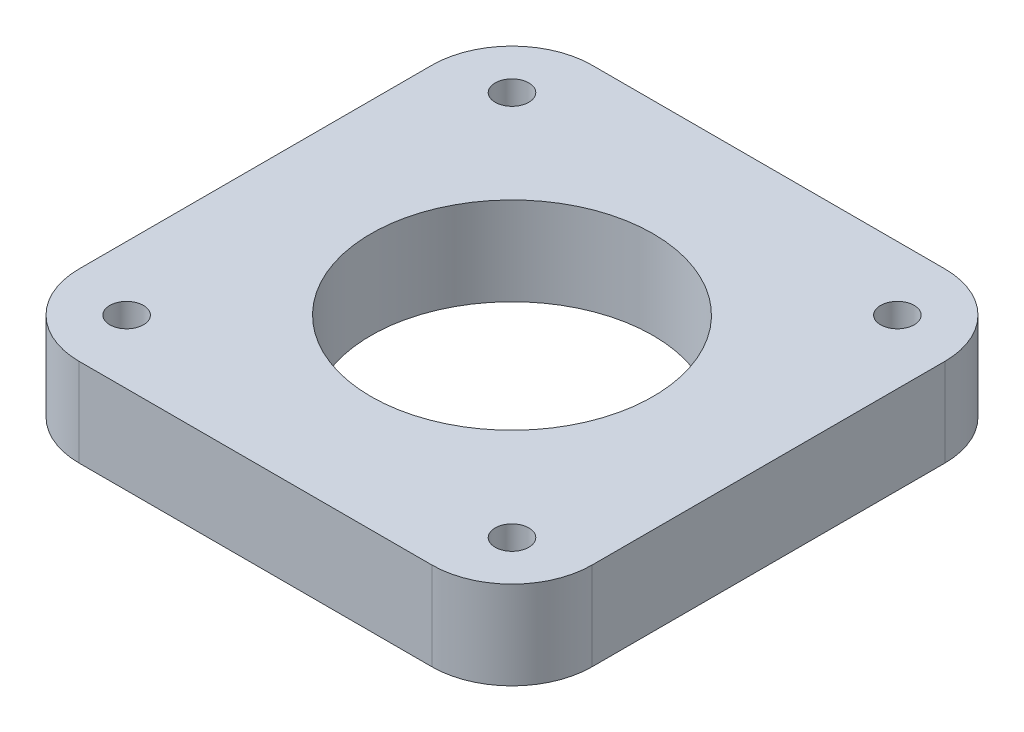
ISO-10303-21;
HEADER;
FILE_DESCRIPTION(('STEP AP214'),'2;1');
FILE_NAME('part.step','',(''),(''),'','','');
FILE_SCHEMA(('AUTOMOTIVE_DESIGN { 1 0 10303 214 1 1 1 1 }'));
ENDSEC;
DATA;
#1=APPLICATION_CONTEXT('core data for automotive mechanical design processes');
#2=APPLICATION_PROTOCOL_DEFINITION('international standard','automotive_design',2000,#1);
#3=PRODUCT_CONTEXT('',#1,'mechanical');
#4=PRODUCT('Part','Part','',(#3));
#5=PRODUCT_RELATED_PRODUCT_CATEGORY('part','',(#4));
#6=PRODUCT_DEFINITION_FORMATION('','',#4);
#7=PRODUCT_DEFINITION_CONTEXT('part definition',#1,'design');
#8=PRODUCT_DEFINITION('design','',#6,#7);
#9=PRODUCT_DEFINITION_SHAPE('','',#8);
#10=(LENGTH_UNIT() NAMED_UNIT(*) SI_UNIT(.MILLI.,.METRE.));
#11=(NAMED_UNIT(*) PLANE_ANGLE_UNIT() SI_UNIT($,.RADIAN.));
#12=(NAMED_UNIT(*) SI_UNIT($,.STERADIAN.) SOLID_ANGLE_UNIT());
#13=UNCERTAINTY_MEASURE_WITH_UNIT(LENGTH_MEASURE(1.E-05),#10,'distance_accuracy_value','');
#14=(GEOMETRIC_REPRESENTATION_CONTEXT(3) GLOBAL_UNCERTAINTY_ASSIGNED_CONTEXT((#13)) GLOBAL_UNIT_ASSIGNED_CONTEXT((#10,
#11,#12)) REPRESENTATION_CONTEXT('',''));
#15=CARTESIAN_POINT('',(0.,0.,0.));
#16=DIRECTION('',(0.,0.,1.));
#17=DIRECTION('',(1.,0.,0.));
#18=AXIS2_PLACEMENT_3D('',#15,#16,#17);
#19=CARTESIAN_POINT('',(32.,11.,32.));
#20=DIRECTION('',(-1.,0.,0.));
#21=DIRECTION('',(0.,0.,1.));
#22=AXIS2_PLACEMENT_3D('',#19,#20,#21);
#23=PLANE('',#22);
#24=DIRECTION('',(0.,0.,-1.));
#25=VECTOR('',#24,1.);
#26=CARTESIAN_POINT('',(32.,11.,32.));
#27=LINE('',#26,#25);
#28=CARTESIAN_POINT('',(32.,11.,22.));
#29=VERTEX_POINT('',#28);
#30=CARTESIAN_POINT('',(32.,11.,-22.));
#31=VERTEX_POINT('',#30);
#32=EDGE_CURVE('E129',#29,#31,#27,.T.);
#33=ORIENTED_EDGE('',*,*,#32,.F.);
#34=DIRECTION('',(0.,-1.,0.));
#35=VECTOR('',#34,1.);
#36=CARTESIAN_POINT('',(32.,11.,22.));
#37=LINE('',#36,#35);
#38=CARTESIAN_POINT('',(32.,0.,22.));
#39=VERTEX_POINT('',#38);
#40=EDGE_CURVE('E114',#29,#39,#37,.T.);
#41=ORIENTED_EDGE('',*,*,#40,.T.);
#42=DIRECTION('',(0.,0.,-1.));
#43=VECTOR('',#42,1.);
#44=CARTESIAN_POINT('',(32.,0.,32.));
#45=LINE('',#44,#43);
#46=CARTESIAN_POINT('',(32.,0.,-22.));
#47=VERTEX_POINT('',#46);
#48=EDGE_CURVE('E126',#39,#47,#45,.T.);
#49=ORIENTED_EDGE('',*,*,#48,.T.);
#50=DIRECTION('',(0.,-1.,0.));
#51=VECTOR('',#50,1.);
#52=CARTESIAN_POINT('',(32.,11.,-22.));
#53=LINE('',#52,#51);
#54=EDGE_CURVE('E131',#47,#31,#53,.F.);
#55=ORIENTED_EDGE('',*,*,#54,.T.);
#56=EDGE_LOOP('',(#33,#41,#49,#55));
#57=FACE_BOUND('',#56,.T.);
#58=ADVANCED_FACE('F43',(#57),#23,.F.);
#59=CARTESIAN_POINT('',(-32.,11.,-32.));
#60=DIRECTION('',(0.,0.,1.));
#61=DIRECTION('',(1.,0.,0.));
#62=AXIS2_PLACEMENT_3D('',#59,#60,#61);
#63=PLANE('',#62);
#64=DIRECTION('',(-1.,0.,0.));
#65=VECTOR('',#64,1.);
#66=CARTESIAN_POINT('',(-32.,11.,-32.));
#67=LINE('',#66,#65);
#68=CARTESIAN_POINT('',(22.,11.,-32.));
#69=VERTEX_POINT('',#68);
#70=CARTESIAN_POINT('',(-22.,11.,-32.));
#71=VERTEX_POINT('',#70);
#72=EDGE_CURVE('E173',#69,#71,#67,.T.);
#73=ORIENTED_EDGE('',*,*,#72,.F.);
#74=DIRECTION('',(0.,-1.,0.));
#75=VECTOR('',#74,1.);
#76=CARTESIAN_POINT('',(22.,11.,-32.));
#77=LINE('',#76,#75);
#78=CARTESIAN_POINT('',(22.,0.,-32.));
#79=VERTEX_POINT('',#78);
#80=EDGE_CURVE('E11',#69,#79,#77,.T.);
#81=ORIENTED_EDGE('',*,*,#80,.T.);
#82=DIRECTION('',(-1.,0.,0.));
#83=VECTOR('',#82,1.);
#84=CARTESIAN_POINT('',(-32.,0.,-32.));
#85=LINE('',#84,#83);
#86=CARTESIAN_POINT('',(-22.,0.,-32.));
#87=VERTEX_POINT('',#86);
#88=EDGE_CURVE('E136',#79,#87,#85,.T.);
#89=ORIENTED_EDGE('',*,*,#88,.T.);
#90=DIRECTION('',(0.,-1.,0.));
#91=VECTOR('',#90,1.);
#92=CARTESIAN_POINT('',(-22.,11.,-32.));
#93=LINE('',#92,#91);
#94=EDGE_CURVE('E51',#87,#71,#93,.F.);
#95=ORIENTED_EDGE('',*,*,#94,.T.);
#96=EDGE_LOOP('',(#73,#81,#89,#95));
#97=FACE_BOUND('',#96,.T.);
#98=ADVANCED_FACE('F172',(#97),#63,.F.);
#99=CARTESIAN_POINT('',(-32.,11.,32.));
#100=DIRECTION('',(1.,0.,0.));
#101=DIRECTION('',(0.,0.,-1.));
#102=AXIS2_PLACEMENT_3D('',#99,#100,#101);
#103=PLANE('',#102);
#104=DIRECTION('',(0.,0.,1.));
#105=VECTOR('',#104,1.);
#106=CARTESIAN_POINT('',(-32.,0.,32.));
#107=LINE('',#106,#105);
#108=CARTESIAN_POINT('',(-32.,0.,-22.));
#109=VERTEX_POINT('',#108);
#110=CARTESIAN_POINT('',(-32.,0.,22.));
#111=VERTEX_POINT('',#110);
#112=EDGE_CURVE('E140',#109,#111,#107,.T.);
#113=ORIENTED_EDGE('',*,*,#112,.T.);
#114=DIRECTION('',(0.,-1.,0.));
#115=VECTOR('',#114,1.);
#116=CARTESIAN_POINT('',(-32.,11.,22.));
#117=LINE('',#116,#115);
#118=CARTESIAN_POINT('',(-32.,11.,22.));
#119=VERTEX_POINT('',#118);
#120=EDGE_CURVE('E58',#111,#119,#117,.F.);
#121=ORIENTED_EDGE('',*,*,#120,.T.);
#122=DIRECTION('',(0.,0.,1.));
#123=VECTOR('',#122,1.);
#124=CARTESIAN_POINT('',(-32.,11.,32.));
#125=LINE('',#124,#123);
#126=CARTESIAN_POINT('',(-32.,11.,-22.));
#127=VERTEX_POINT('',#126);
#128=EDGE_CURVE('E179',#127,#119,#125,.T.);
#129=ORIENTED_EDGE('',*,*,#128,.F.);
#130=DIRECTION('',(0.,-1.,0.));
#131=VECTOR('',#130,1.);
#132=CARTESIAN_POINT('',(-32.,11.,-22.));
#133=LINE('',#132,#131);
#134=EDGE_CURVE('E166',#127,#109,#133,.T.);
#135=ORIENTED_EDGE('',*,*,#134,.T.);
#136=EDGE_LOOP('',(#113,#121,#129,#135));
#137=FACE_BOUND('',#136,.T.);
#138=ADVANCED_FACE('F183',(#137),#103,.F.);
#139=CARTESIAN_POINT('',(-32.,11.,32.));
#140=DIRECTION('',(0.,0.,-1.));
#141=DIRECTION('',(-1.,0.,0.));
#142=AXIS2_PLACEMENT_3D('',#139,#140,#141);
#143=PLANE('',#142);
#144=DIRECTION('',(1.,0.,0.));
#145=VECTOR('',#144,1.);
#146=CARTESIAN_POINT('',(-32.,0.,32.));
#147=LINE('',#146,#145);
#148=CARTESIAN_POINT('',(-22.,0.,32.));
#149=VERTEX_POINT('',#148);
#150=CARTESIAN_POINT('',(22.,0.,32.));
#151=VERTEX_POINT('',#150);
#152=EDGE_CURVE('E150',#149,#151,#147,.T.);
#153=ORIENTED_EDGE('',*,*,#152,.T.);
#154=DIRECTION('',(0.,-1.,0.));
#155=VECTOR('',#154,1.);
#156=CARTESIAN_POINT('',(22.,11.,32.));
#157=LINE('',#156,#155);
#158=CARTESIAN_POINT('',(22.,11.,32.));
#159=VERTEX_POINT('',#158);
#160=EDGE_CURVE('E115',#151,#159,#157,.F.);
#161=ORIENTED_EDGE('',*,*,#160,.T.);
#162=DIRECTION('',(1.,0.,0.));
#163=VECTOR('',#162,1.);
#164=CARTESIAN_POINT('',(-32.,11.,32.));
#165=LINE('',#164,#163);
#166=CARTESIAN_POINT('',(-22.,11.,32.));
#167=VERTEX_POINT('',#166);
#168=EDGE_CURVE('E146',#167,#159,#165,.T.);
#169=ORIENTED_EDGE('',*,*,#168,.F.);
#170=DIRECTION('',(0.,-1.,0.));
#171=VECTOR('',#170,1.);
#172=CARTESIAN_POINT('',(-22.,11.,32.));
#173=LINE('',#172,#171);
#174=EDGE_CURVE('E120',#167,#149,#173,.T.);
#175=ORIENTED_EDGE('',*,*,#174,.T.);
#176=EDGE_LOOP('',(#153,#161,#169,#175));
#177=FACE_BOUND('',#176,.T.);
#178=ADVANCED_FACE('F190',(#177),#143,.F.);
#179=CARTESIAN_POINT('',(0.,11.,0.));
#180=DIRECTION('',(0.,-1.,0.));
#181=DIRECTION('',(0.,0.,-1.));
#182=AXIS2_PLACEMENT_3D('',#179,#180,#181);
#183=PLANE('',#182);
#184=CARTESIAN_POINT('',(-24.0416305603426,11.,-24.0416305603426));
#185=DIRECTION('',(0.,1.,0.));
#186=DIRECTION('',(0.,0.,1.));
#187=AXIS2_PLACEMENT_3D('',#184,#185,#186);
#188=CIRCLE('',#187,2.1);
#189=CARTESIAN_POINT('',(-24.0416305603426,11.,-21.9416305603426));
#190=VERTEX_POINT('',#189);
#191=EDGE_CURVE('E199',#190,#190,#188,.T.);
#192=ORIENTED_EDGE('',*,*,#191,.F.);
#193=EDGE_LOOP('',(#192));
#194=FACE_BOUND('',#193,.T.);
#195=CARTESIAN_POINT('',(-24.0416305603426,11.,24.0416305603426));
#196=DIRECTION('',(0.,1.,0.));
#197=DIRECTION('',(0.,0.,1.));
#198=AXIS2_PLACEMENT_3D('',#195,#196,#197);
#199=CIRCLE('',#198,2.1);
#200=CARTESIAN_POINT('',(-24.0416305603426,11.,26.1416305603426));
#201=VERTEX_POINT('',#200);
#202=EDGE_CURVE('E205',#201,#201,#199,.T.);
#203=ORIENTED_EDGE('',*,*,#202,.F.);
#204=EDGE_LOOP('',(#203));
#205=FACE_BOUND('',#204,.T.);
#206=CARTESIAN_POINT('',(24.0416305603426,11.,24.0416305603426));
#207=DIRECTION('',(0.,1.,0.));
#208=DIRECTION('',(0.,0.,1.));
#209=AXIS2_PLACEMENT_3D('',#206,#207,#208);
#210=CIRCLE('',#209,2.1);
#211=CARTESIAN_POINT('',(24.0416305603426,11.,26.1416305603426));
#212=VERTEX_POINT('',#211);
#213=EDGE_CURVE('E211',#212,#212,#210,.T.);
#214=ORIENTED_EDGE('',*,*,#213,.F.);
#215=EDGE_LOOP('',(#214));
#216=FACE_BOUND('',#215,.T.);
#217=CARTESIAN_POINT('',(24.0416305603426,11.,-24.0416305603426));
#218=DIRECTION('',(0.,1.,0.));
#219=DIRECTION('',(0.,0.,1.));
#220=AXIS2_PLACEMENT_3D('',#217,#218,#219);
#221=CIRCLE('',#220,2.1);
#222=CARTESIAN_POINT('',(24.0416305603426,11.,-21.9416305603426));
#223=VERTEX_POINT('',#222);
#224=EDGE_CURVE('E194',#223,#223,#221,.T.);
#225=ORIENTED_EDGE('',*,*,#224,.F.);
#226=EDGE_LOOP('',(#225));
#227=FACE_BOUND('',#226,.T.);
#228=CARTESIAN_POINT('',(0.,11.,0.));
#229=DIRECTION('',(0.,1.,0.));
#230=DIRECTION('',(0.,0.,1.));
#231=AXIS2_PLACEMENT_3D('',#228,#229,#230);
#232=CIRCLE('',#231,17.6);
#233=CARTESIAN_POINT('',(0.,11.,17.6));
#234=VERTEX_POINT('',#233);
#235=EDGE_CURVE('E143',#234,#234,#232,.T.);
#236=ORIENTED_EDGE('',*,*,#235,.F.);
#237=EDGE_LOOP('',(#236));
#238=FACE_BOUND('',#237,.T.);
#239=ORIENTED_EDGE('',*,*,#168,.T.);
#240=CARTESIAN_POINT('',(22.,11.,22.));
#241=DIRECTION('',(0.,-1.,0.));
#242=DIRECTION('',(0.,0.,-1.));
#243=AXIS2_PLACEMENT_3D('',#240,#241,#242);
#244=CIRCLE('',#243,10.);
#245=EDGE_CURVE('E164',#159,#29,#244,.F.);
#246=ORIENTED_EDGE('',*,*,#245,.T.);
#247=ORIENTED_EDGE('',*,*,#32,.T.);
#248=CARTESIAN_POINT('',(22.,11.,-22.));
#249=DIRECTION('',(0.,-1.,0.));
#250=DIRECTION('',(0.,0.,-1.));
#251=AXIS2_PLACEMENT_3D('',#248,#249,#250);
#252=CIRCLE('',#251,10.);
#253=EDGE_CURVE('E160',#31,#69,#252,.F.);
#254=ORIENTED_EDGE('',*,*,#253,.T.);
#255=ORIENTED_EDGE('',*,*,#72,.T.);
#256=CARTESIAN_POINT('',(-22.,11.,-22.));
#257=DIRECTION('',(0.,-1.,0.));
#258=DIRECTION('',(0.,0.,-1.));
#259=AXIS2_PLACEMENT_3D('',#256,#257,#258);
#260=CIRCLE('',#259,10.);
#261=EDGE_CURVE('E65',#71,#127,#260,.F.);
#262=ORIENTED_EDGE('',*,*,#261,.T.);
#263=ORIENTED_EDGE('',*,*,#128,.T.);
#264=CARTESIAN_POINT('',(-22.,11.,22.));
#265=DIRECTION('',(0.,-1.,0.));
#266=DIRECTION('',(0.,0.,-1.));
#267=AXIS2_PLACEMENT_3D('',#264,#265,#266);
#268=CIRCLE('',#267,10.);
#269=EDGE_CURVE('E162',#119,#167,#268,.F.);
#270=ORIENTED_EDGE('',*,*,#269,.T.);
#271=EDGE_LOOP('',(#239,#246,#247,#254,#255,#262,#263,#270));
#272=FACE_BOUND('',#271,.T.);
#273=ADVANCED_FACE('F177',(#194,#205,#216,#227,#238,#272),#183,.F.);
#274=CARTESIAN_POINT('',(0.,0.,0.));
#275=DIRECTION('',(0.,-1.,0.));
#276=DIRECTION('',(0.,0.,-1.));
#277=AXIS2_PLACEMENT_3D('',#274,#275,#276);
#278=PLANE('',#277);
#279=CARTESIAN_POINT('',(-24.0416305603426,0.,-24.0416305603426));
#280=DIRECTION('',(0.,1.,0.));
#281=DIRECTION('',(0.,0.,1.));
#282=AXIS2_PLACEMENT_3D('',#279,#280,#281);
#283=CIRCLE('',#282,2.1);
#284=CARTESIAN_POINT('',(-24.0416305603426,0.,-21.9416305603426));
#285=VERTEX_POINT('',#284);
#286=EDGE_CURVE('E196',#285,#285,#283,.T.);
#287=ORIENTED_EDGE('',*,*,#286,.T.);
#288=EDGE_LOOP('',(#287));
#289=FACE_BOUND('',#288,.T.);
#290=CARTESIAN_POINT('',(-24.0416305603426,0.,24.0416305603426));
#291=DIRECTION('',(0.,1.,0.));
#292=DIRECTION('',(0.,0.,1.));
#293=AXIS2_PLACEMENT_3D('',#290,#291,#292);
#294=CIRCLE('',#293,2.1);
#295=CARTESIAN_POINT('',(-24.0416305603426,0.,26.1416305603426));
#296=VERTEX_POINT('',#295);
#297=EDGE_CURVE('E202',#296,#296,#294,.T.);
#298=ORIENTED_EDGE('',*,*,#297,.T.);
#299=EDGE_LOOP('',(#298));
#300=FACE_BOUND('',#299,.T.);
#301=CARTESIAN_POINT('',(24.0416305603426,0.,24.0416305603426));
#302=DIRECTION('',(0.,1.,0.));
#303=DIRECTION('',(0.,0.,1.));
#304=AXIS2_PLACEMENT_3D('',#301,#302,#303);
#305=CIRCLE('',#304,2.1);
#306=CARTESIAN_POINT('',(24.0416305603426,0.,26.1416305603426));
#307=VERTEX_POINT('',#306);
#308=EDGE_CURVE('E208',#307,#307,#305,.T.);
#309=ORIENTED_EDGE('',*,*,#308,.T.);
#310=EDGE_LOOP('',(#309));
#311=FACE_BOUND('',#310,.T.);
#312=CARTESIAN_POINT('',(24.0416305603426,0.,-24.0416305603426));
#313=DIRECTION('',(0.,1.,0.));
#314=DIRECTION('',(0.,0.,1.));
#315=AXIS2_PLACEMENT_3D('',#312,#313,#314);
#316=CIRCLE('',#315,2.1);
#317=CARTESIAN_POINT('',(24.0416305603426,0.,-21.9416305603426));
#318=VERTEX_POINT('',#317);
#319=EDGE_CURVE('E214',#318,#318,#316,.T.);
#320=ORIENTED_EDGE('',*,*,#319,.T.);
#321=EDGE_LOOP('',(#320));
#322=FACE_BOUND('',#321,.T.);
#323=CARTESIAN_POINT('',(0.,0.,0.));
#324=DIRECTION('',(0.,1.,0.));
#325=DIRECTION('',(0.,0.,1.));
#326=AXIS2_PLACEMENT_3D('',#323,#324,#325);
#327=CIRCLE('',#326,17.6);
#328=CARTESIAN_POINT('',(0.,0.,17.6));
#329=VERTEX_POINT('',#328);
#330=EDGE_CURVE('E137',#329,#329,#327,.T.);
#331=ORIENTED_EDGE('',*,*,#330,.T.);
#332=EDGE_LOOP('',(#331));
#333=FACE_BOUND('',#332,.T.);
#334=ORIENTED_EDGE('',*,*,#48,.F.);
#335=CARTESIAN_POINT('',(22.,0.,22.));
#336=DIRECTION('',(0.,-1.,0.));
#337=DIRECTION('',(0.,0.,-1.));
#338=AXIS2_PLACEMENT_3D('',#335,#336,#337);
#339=CIRCLE('',#338,10.);
#340=EDGE_CURVE('E110',#39,#151,#339,.T.);
#341=ORIENTED_EDGE('',*,*,#340,.T.);
#342=ORIENTED_EDGE('',*,*,#152,.F.);
#343=CARTESIAN_POINT('',(-22.,0.,22.));
#344=DIRECTION('',(0.,-1.,0.));
#345=DIRECTION('',(0.,0.,-1.));
#346=AXIS2_PLACEMENT_3D('',#343,#344,#345);
#347=CIRCLE('',#346,10.);
#348=EDGE_CURVE('E121',#149,#111,#347,.T.);
#349=ORIENTED_EDGE('',*,*,#348,.T.);
#350=ORIENTED_EDGE('',*,*,#112,.F.);
#351=CARTESIAN_POINT('',(-22.,0.,-22.));
#352=DIRECTION('',(0.,-1.,0.));
#353=DIRECTION('',(0.,0.,-1.));
#354=AXIS2_PLACEMENT_3D('',#351,#352,#353);
#355=CIRCLE('',#354,10.);
#356=EDGE_CURVE('E130',#109,#87,#355,.T.);
#357=ORIENTED_EDGE('',*,*,#356,.T.);
#358=ORIENTED_EDGE('',*,*,#88,.F.);
#359=CARTESIAN_POINT('',(22.,0.,-22.));
#360=DIRECTION('',(0.,-1.,0.));
#361=DIRECTION('',(0.,0.,-1.));
#362=AXIS2_PLACEMENT_3D('',#359,#360,#361);
#363=CIRCLE('',#362,10.);
#364=EDGE_CURVE('E135',#79,#47,#363,.T.);
#365=ORIENTED_EDGE('',*,*,#364,.T.);
#366=EDGE_LOOP('',(#334,#341,#342,#349,#350,#357,#358,#365));
#367=FACE_BOUND('',#366,.T.);
#368=ADVANCED_FACE('F133',(#289,#300,#311,#322,#333,#367),#278,.T.);
#369=CARTESIAN_POINT('',(0.,0.,0.));
#370=DIRECTION('',(0.,1.,0.));
#371=DIRECTION('',(0.,0.,1.));
#372=AXIS2_PLACEMENT_3D('',#369,#370,#371);
#373=CYLINDRICAL_SURFACE('',#372,17.6);
#374=ORIENTED_EDGE('',*,*,#330,.F.);
#375=EDGE_LOOP('',(#374));
#376=FACE_BOUND('',#375,.T.);
#377=ORIENTED_EDGE('',*,*,#235,.T.);
#378=EDGE_LOOP('',(#377));
#379=FACE_BOUND('',#378,.T.);
#380=ADVANCED_FACE('F228',(#376,#379),#373,.F.);
#381=CARTESIAN_POINT('',(24.0416305603426,0.,-24.0416305603426));
#382=DIRECTION('',(0.,1.,0.));
#383=DIRECTION('',(0.,0.,1.));
#384=AXIS2_PLACEMENT_3D('',#381,#382,#383);
#385=CYLINDRICAL_SURFACE('',#384,2.1);
#386=ORIENTED_EDGE('',*,*,#319,.F.);
#387=EDGE_LOOP('',(#386));
#388=FACE_BOUND('',#387,.T.);
#389=ORIENTED_EDGE('',*,*,#224,.T.);
#390=EDGE_LOOP('',(#389));
#391=FACE_BOUND('',#390,.T.);
#392=ADVANCED_FACE('F220',(#388,#391),#385,.F.);
#393=CARTESIAN_POINT('',(24.0416305603426,0.,24.0416305603426));
#394=DIRECTION('',(0.,1.,0.));
#395=DIRECTION('',(0.,0.,1.));
#396=AXIS2_PLACEMENT_3D('',#393,#394,#395);
#397=CYLINDRICAL_SURFACE('',#396,2.1);
#398=ORIENTED_EDGE('',*,*,#308,.F.);
#399=EDGE_LOOP('',(#398));
#400=FACE_BOUND('',#399,.T.);
#401=ORIENTED_EDGE('',*,*,#213,.T.);
#402=EDGE_LOOP('',(#401));
#403=FACE_BOUND('',#402,.T.);
#404=ADVANCED_FACE('F235',(#400,#403),#397,.F.);
#405=CARTESIAN_POINT('',(-24.0416305603426,0.,24.0416305603426));
#406=DIRECTION('',(0.,1.,0.));
#407=DIRECTION('',(0.,0.,1.));
#408=AXIS2_PLACEMENT_3D('',#405,#406,#407);
#409=CYLINDRICAL_SURFACE('',#408,2.1);
#410=ORIENTED_EDGE('',*,*,#297,.F.);
#411=EDGE_LOOP('',(#410));
#412=FACE_BOUND('',#411,.T.);
#413=ORIENTED_EDGE('',*,*,#202,.T.);
#414=EDGE_LOOP('',(#413));
#415=FACE_BOUND('',#414,.T.);
#416=ADVANCED_FACE('F289',(#412,#415),#409,.F.);
#417=CARTESIAN_POINT('',(-24.0416305603426,0.,-24.0416305603426));
#418=DIRECTION('',(0.,1.,0.));
#419=DIRECTION('',(0.,0.,1.));
#420=AXIS2_PLACEMENT_3D('',#417,#418,#419);
#421=CYLINDRICAL_SURFACE('',#420,2.1);
#422=ORIENTED_EDGE('',*,*,#286,.F.);
#423=EDGE_LOOP('',(#422));
#424=FACE_BOUND('',#423,.T.);
#425=ORIENTED_EDGE('',*,*,#191,.T.);
#426=EDGE_LOOP('',(#425));
#427=FACE_BOUND('',#426,.T.);
#428=ADVANCED_FACE('F252',(#424,#427),#421,.F.);
#429=CARTESIAN_POINT('',(22.,11.,22.));
#430=DIRECTION('',(0.,-1.,0.));
#431=DIRECTION('',(0.,0.,-1.));
#432=AXIS2_PLACEMENT_3D('',#429,#430,#431);
#433=CYLINDRICAL_SURFACE('',#432,10.);
#434=ORIENTED_EDGE('',*,*,#245,.F.);
#435=ORIENTED_EDGE('',*,*,#160,.F.);
#436=ORIENTED_EDGE('',*,*,#340,.F.);
#437=ORIENTED_EDGE('',*,*,#40,.F.);
#438=EDGE_LOOP('',(#434,#435,#436,#437));
#439=FACE_BOUND('',#438,.T.);
#440=ADVANCED_FACE('F113',(#439),#433,.T.);
#441=CARTESIAN_POINT('',(-22.,11.,22.));
#442=DIRECTION('',(0.,-1.,0.));
#443=DIRECTION('',(0.,0.,-1.));
#444=AXIS2_PLACEMENT_3D('',#441,#442,#443);
#445=CYLINDRICAL_SURFACE('',#444,10.);
#446=ORIENTED_EDGE('',*,*,#269,.F.);
#447=ORIENTED_EDGE('',*,*,#120,.F.);
#448=ORIENTED_EDGE('',*,*,#348,.F.);
#449=ORIENTED_EDGE('',*,*,#174,.F.);
#450=EDGE_LOOP('',(#446,#447,#448,#449));
#451=FACE_BOUND('',#450,.T.);
#452=ADVANCED_FACE('F187',(#451),#445,.T.);
#453=CARTESIAN_POINT('',(22.,11.,-22.));
#454=DIRECTION('',(0.,-1.,0.));
#455=DIRECTION('',(0.,0.,-1.));
#456=AXIS2_PLACEMENT_3D('',#453,#454,#455);
#457=CYLINDRICAL_SURFACE('',#456,10.);
#458=ORIENTED_EDGE('',*,*,#253,.F.);
#459=ORIENTED_EDGE('',*,*,#54,.F.);
#460=ORIENTED_EDGE('',*,*,#364,.F.);
#461=ORIENTED_EDGE('',*,*,#80,.F.);
#462=EDGE_LOOP('',(#458,#459,#460,#461));
#463=FACE_BOUND('',#462,.T.);
#464=ADVANCED_FACE('F254',(#463),#457,.T.);
#465=CARTESIAN_POINT('',(-22.,11.,-22.));
#466=DIRECTION('',(0.,-1.,0.));
#467=DIRECTION('',(0.,0.,-1.));
#468=AXIS2_PLACEMENT_3D('',#465,#466,#467);
#469=CYLINDRICAL_SURFACE('',#468,10.);
#470=ORIENTED_EDGE('',*,*,#261,.F.);
#471=ORIENTED_EDGE('',*,*,#94,.F.);
#472=ORIENTED_EDGE('',*,*,#356,.F.);
#473=ORIENTED_EDGE('',*,*,#134,.F.);
#474=EDGE_LOOP('',(#470,#471,#472,#473));
#475=FACE_BOUND('',#474,.T.);
#476=ADVANCED_FACE('F45',(#475),#469,.T.);
#477=CLOSED_SHELL('',(#58,#98,#138,#178,#273,#368,#380,#392,#404,#416,#428,#440,#452,#464,#476));
#478=MANIFOLD_SOLID_BREP('B2',#477);
#479=ADVANCED_BREP_SHAPE_REPRESENTATION('',(#18,#478),#14);
#480=SHAPE_DEFINITION_REPRESENTATION(#9,#479);
ENDSEC;
END-ISO-10303-21;
